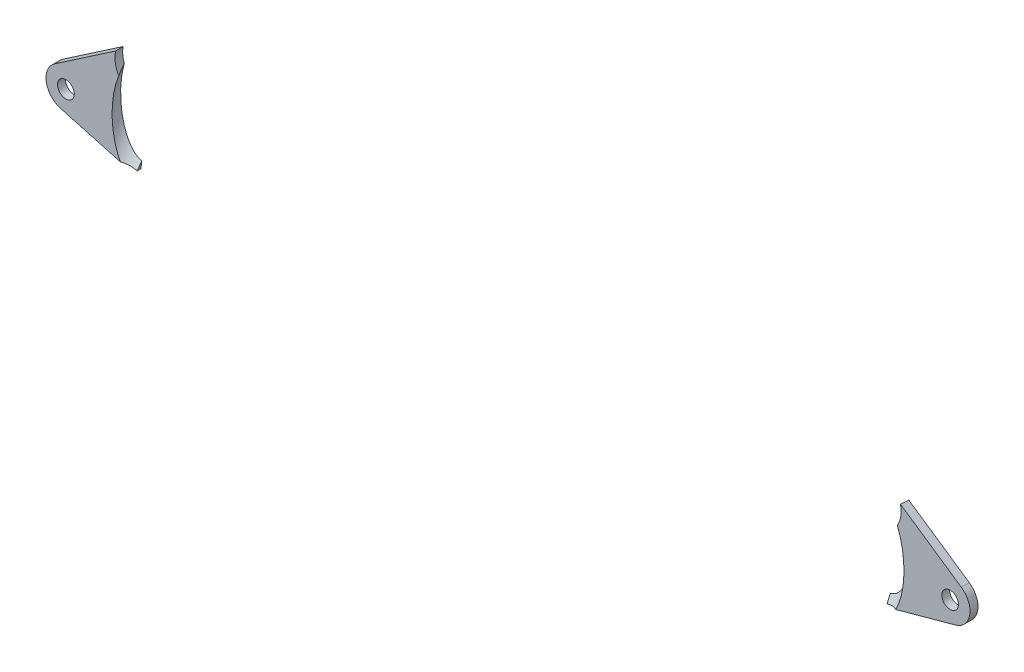
ISO-10303-21;
HEADER;
FILE_DESCRIPTION(('STEP AP214'),'2;1');
FILE_NAME('part.step','',(''),(''),'','','');
FILE_SCHEMA(('AUTOMOTIVE_DESIGN { 1 0 10303 214 1 1 1 1 }'));
ENDSEC;
DATA;
#1=APPLICATION_CONTEXT('core data for automotive mechanical design processes');
#2=APPLICATION_PROTOCOL_DEFINITION('international standard','automotive_design',2000,#1);
#3=PRODUCT_CONTEXT('',#1,'mechanical');
#4=PRODUCT('Part','Part','',(#3));
#5=PRODUCT_RELATED_PRODUCT_CATEGORY('part','',(#4));
#6=PRODUCT_DEFINITION_FORMATION('','',#4);
#7=PRODUCT_DEFINITION_CONTEXT('part definition',#1,'design');
#8=PRODUCT_DEFINITION('design','',#6,#7);
#9=PRODUCT_DEFINITION_SHAPE('','',#8);
#10=(LENGTH_UNIT() NAMED_UNIT(*) SI_UNIT(.MILLI.,.METRE.));
#11=(NAMED_UNIT(*) PLANE_ANGLE_UNIT() SI_UNIT($,.RADIAN.));
#12=(NAMED_UNIT(*) SI_UNIT($,.STERADIAN.) SOLID_ANGLE_UNIT());
#13=UNCERTAINTY_MEASURE_WITH_UNIT(LENGTH_MEASURE(1.E-05),#10,'distance_accuracy_value','');
#14=(GEOMETRIC_REPRESENTATION_CONTEXT(3) GLOBAL_UNCERTAINTY_ASSIGNED_CONTEXT((#13)) GLOBAL_UNIT_ASSIGNED_CONTEXT((#10,
#11,#12)) REPRESENTATION_CONTEXT('',''));
#15=CARTESIAN_POINT('',(0.,0.,0.));
#16=DIRECTION('',(0.,0.,1.));
#17=DIRECTION('',(1.,0.,0.));
#18=AXIS2_PLACEMENT_3D('',#15,#16,#17);
#19=CARTESIAN_POINT('',(-6.76283675777758E-06,4.26355604611976E-06,-523.500007590512));
#20=DIRECTION('',(-1.28205434326738E-08,8.08257059396244E-09,-1.));
#21=DIRECTION('',(1.,0.,-1.28205434326738E-08));
#22=AXIS2_PLACEMENT_3D('',#19,#20,#21);
#23=PLANE('',#22);
#24=CARTESIAN_POINT('',(-221.892352261675,576.107647738325,-523.5));
#25=DIRECTION('',(-1.78976740835188E-08,-2.85283172746497E-08,-0.999999999999999));
#26=DIRECTION('',(0.,-1.,2.85283172746497E-08));
#27=AXIS2_PLACEMENT_3D('',#24,#25,#26);
#28=CIRCLE('',#27,4.19999999999995);
#29=CARTESIAN_POINT('',(-221.892352261675,571.907647738325,-523.499999880181));
#30=VERTEX_POINT('',#29);
#31=EDGE_CURVE('E243',#30,#30,#28,.T.);
#32=ORIENTED_EDGE('',*,*,#31,.T.);
#33=EDGE_LOOP('',(#32));
#34=FACE_BOUND('',#33,.T.);
#35=CARTESIAN_POINT('',(-185.997260236363,578.761644787544,-523.500000528045));
#36=DIRECTION('',(1.28205434326738E-08,-8.08257059396244E-09,1.));
#37=DIRECTION('',(0.0394828741983421,0.999220247315394,7.57007628433665E-09));
#38=AXIS2_PLACEMENT_3D('',#35,#36,#37);
#39=ELLIPSE('',#38,26.1969464374496,12.7);
#40=CARTESIAN_POINT('',(-194.494659068228,558.21631498243,-523.500000348071));
#41=VERTEX_POINT('',#40);
#42=CARTESIAN_POINT('',(-195.357801000429,595.278762168306,-523.500000274537));
#43=VERTEX_POINT('',#42);
#44=EDGE_CURVE('E162',#41,#43,#39,.F.);
#45=ORIENTED_EDGE('',*,*,#44,.T.);
#46=CARTESIAN_POINT('',(-184.609302335556,602.072558188744,-523.500000357427));
#47=DIRECTION('',(1.28205434326738E-08,-8.08257059396244E-09,1.));
#48=DIRECTION('',(-0.198662351333892,0.98006799262219,1.04684280409652E-08));
#49=AXIS2_PLACEMENT_3D('',#46,#47,#48);
#50=ELLIPSE('',#49,12.8246926796099,12.7);
#51=CARTESIAN_POINT('',(-196.929839573321,605.249481408293,-523.500000000358));
#52=VERTEX_POINT('',#51);
#53=EDGE_CURVE('E211',#43,#52,#50,.F.);
#54=ORIENTED_EDGE('',*,*,#53,.T.);
#55=DIRECTION('',(-0.825991902443792,-0.563681982235804,2.80436123324251E-09));
#56=VECTOR('',#55,1.);
#57=CARTESIAN_POINT('',(-191.789711937302,608.75726075364,-523.500000017809));
#58=LINE('',#57,#56);
#59=CARTESIAN_POINT('',(-227.529172084033,584.367566762763,-523.499999896469));
#60=VERTEX_POINT('',#59);
#61=EDGE_CURVE('E249',#52,#60,#58,.T.);
#62=ORIENTED_EDGE('',*,*,#61,.T.);
#63=CARTESIAN_POINT('',(-221.892352261675,576.107647738325,-523.5));
#64=DIRECTION('',(8.15225942307762E-09,-6.97084612255593E-09,1.));
#65=DIRECTION('',(1.,0.,-8.15225942307762E-09));
#66=AXIS2_PLACEMENT_3D('',#63,#64,#65);
#67=CIRCLE('',#66,10.0000000000001);
#68=CARTESIAN_POINT('',(-224.539659918857,566.464424098471,-523.50000004564));
#69=VERTEX_POINT('',#68);
#70=EDGE_CURVE('E252',#60,#69,#67,.T.);
#71=ORIENTED_EDGE('',*,*,#70,.T.);
#72=DIRECTION('',(-0.964322363985336,0.26473076571818,9.7067964222213E-09));
#73=VECTOR('',#72,1.);
#74=CARTESIAN_POINT('',(-188.174312205241,556.481220653881,-523.500000411691));
#75=LINE('',#74,#73);
#76=EDGE_CURVE('E266',#41,#69,#75,.T.);
#77=ORIENTED_EDGE('',*,*,#76,.F.);
#78=EDGE_LOOP('',(#45,#54,#62,#71,#77));
#79=FACE_BOUND('',#78,.T.);
#80=ADVANCED_FACE('F153',(#34,#79),#23,.F.);
#81=CARTESIAN_POINT('',(-6.76283675804992E-06,4.26355604966604E-06,-527.500007590512));
#82=DIRECTION('',(-1.28205434326738E-08,8.08257059396244E-09,-1.));
#83=DIRECTION('',(1.,0.,-1.28205434326738E-08));
#84=AXIS2_PLACEMENT_3D('',#81,#82,#83);
#85=PLANE('',#84);
#86=CARTESIAN_POINT('',(-221.892352261675,576.107647738325,-527.5));
#87=DIRECTION('',(-1.78976740835188E-08,-2.85283172746497E-08,-0.999999999999999));
#88=DIRECTION('',(0.,-1.,2.85283172746497E-08));
#89=AXIS2_PLACEMENT_3D('',#86,#87,#88);
#90=CIRCLE('',#89,4.19999999999995);
#91=CARTESIAN_POINT('',(-221.892352261675,571.907647738325,-527.499999880181));
#92=VERTEX_POINT('',#91);
#93=EDGE_CURVE('E221',#92,#92,#90,.T.);
#94=ORIENTED_EDGE('',*,*,#93,.F.);
#95=EDGE_LOOP('',(#94));
#96=FACE_BOUND('',#95,.T.);
#97=DIRECTION('',(-0.0815294772708344,-0.99667093081716,1.03961991727305E-09));
#98=VECTOR('',#97,1.);
#99=CARTESIAN_POINT('',(-184.720930245276,598.697674477955,-527.500000455726));
#100=LINE('',#99,#98);
#101=CARTESIAN_POINT('',(-187.890655415792,559.948831214335,-527.500000415308));
#102=VERTEX_POINT('',#101);
#103=CARTESIAN_POINT('',(-188.174312205241,556.481220653881,-527.500000411691));
#104=VERTEX_POINT('',#103);
#105=EDGE_CURVE('E277',#102,#104,#100,.T.);
#106=ORIENTED_EDGE('',*,*,#105,.T.);
#107=DIRECTION('',(-0.964322363985336,0.26473076571818,9.7067964222213E-09));
#108=VECTOR('',#107,1.);
#109=CARTESIAN_POINT('',(-188.174312205241,556.481220653881,-527.500000411691));
#110=LINE('',#109,#108);
#111=CARTESIAN_POINT('',(-224.539659918857,566.464424098471,-527.50000004564));
#112=VERTEX_POINT('',#111);
#113=EDGE_CURVE('E244',#104,#112,#110,.T.);
#114=ORIENTED_EDGE('',*,*,#113,.T.);
#115=CARTESIAN_POINT('',(-221.892352261675,576.107647738325,-527.5));
#116=DIRECTION('',(8.15225942307762E-09,-6.97084612255593E-09,1.));
#117=DIRECTION('',(1.,0.,-8.15225942307762E-09));
#118=AXIS2_PLACEMENT_3D('',#115,#116,#117);
#119=CIRCLE('',#118,10.0000000000001);
#120=CARTESIAN_POINT('',(-227.529172084033,584.367566762763,-527.499999896469));
#121=VERTEX_POINT('',#120);
#122=EDGE_CURVE('E228',#121,#112,#119,.T.);
#123=ORIENTED_EDGE('',*,*,#122,.F.);
#124=DIRECTION('',(-0.825991902443792,-0.563681982235804,2.80436123324251E-09));
#125=VECTOR('',#124,1.);
#126=CARTESIAN_POINT('',(-191.789711937302,608.75726075364,-527.500000017809));
#127=LINE('',#126,#125);
#128=CARTESIAN_POINT('',(-197.202740767991,605.063245337563,-527.499999999431));
#129=VERTEX_POINT('',#128);
#130=EDGE_CURVE('E226',#129,#121,#127,.T.);
#131=ORIENTED_EDGE('',*,*,#130,.F.);
#132=CARTESIAN_POINT('',(-184.720930242369,602.623255862352,-527.500000351545));
#133=DIRECTION('',(1.28205434326738E-08,-8.08257059396244E-09,1.));
#134=DIRECTION('',(-0.198662351333892,0.98006799262219,1.04684280409652E-08));
#135=AXIS2_PLACEMENT_3D('',#132,#133,#134);
#136=ELLIPSE('',#135,12.8246926796099,12.7);
#137=CARTESIAN_POINT('',(-196.600940213147,598.124746547628,-527.500000235596));
#138=VERTEX_POINT('',#137);
#139=EDGE_CURVE('E208',#138,#129,#136,.F.);
#140=ORIENTED_EDGE('',*,*,#139,.F.);
#141=CARTESIAN_POINT('',(-185.712328733405,585.97260359317,-527.500000473415));
#142=DIRECTION('',(1.28205434326738E-08,-8.08257059396244E-09,1.));
#143=DIRECTION('',(0.0394828741983421,0.999220247315394,7.57007628433665E-09));
#144=AXIS2_PLACEMENT_3D('',#141,#142,#143);
#145=ELLIPSE('',#144,26.1969464374496,12.7);
#146=EDGE_CURVE('E214',#102,#138,#145,.F.);
#147=ORIENTED_EDGE('',*,*,#146,.F.);
#148=EDGE_LOOP('',(#106,#114,#123,#131,#140,#147));
#149=FACE_BOUND('',#148,.T.);
#150=ADVANCED_FACE('F223',(#96,#149),#85,.T.);
#151=CARTESIAN_POINT('',(-191.789711937302,608.75726075364,-527.500000017809));
#152=DIRECTION('',(0.563681982235804,-0.825991902443792,0.));
#153=DIRECTION('',(-0.825991902443792,-0.563681982235804,0.));
#154=AXIS2_PLACEMENT_3D('',#151,#152,#153);
#155=PLANE('',#154);
#156=CARTESIAN_POINT('',(-186.67221539572,612.249595952218,-597.421051679941));
#157=DIRECTION('',(-0.563681982235804,0.825991902443792,0.));
#158=DIRECTION('',(0.0449939715456335,0.0307052538825957,-0.9985152627319));
#159=AXIS2_PLACEMENT_3D('',#156,#157,#158);
#160=ELLIPSE('',#159,99.07168730493,12.7);
#161=EDGE_CURVE('E270',#52,#129,#160,.F.);
#162=ORIENTED_EDGE('',*,*,#161,.T.);
#163=ORIENTED_EDGE('',*,*,#130,.T.);
#164=DIRECTION('',(0.,0.,1.));
#165=VECTOR('',#164,1.);
#166=CARTESIAN_POINT('',(-227.529172084033,584.367566762763,-527.499999896469));
#167=LINE('',#166,#165);
#168=EDGE_CURVE('E238',#121,#60,#167,.T.);
#169=ORIENTED_EDGE('',*,*,#168,.T.);
#170=ORIENTED_EDGE('',*,*,#61,.F.);
#171=EDGE_LOOP('',(#162,#163,#169,#170));
#172=FACE_BOUND('',#171,.T.);
#173=ADVANCED_FACE('F287',(#172),#155,.F.);
#174=CARTESIAN_POINT('',(-221.892352261675,576.107647738325,-527.5));
#175=DIRECTION('',(0.,0.,1.));
#176=DIRECTION('',(0.,-1.,0.));
#177=AXIS2_PLACEMENT_3D('',#174,#175,#176);
#178=CYLINDRICAL_SURFACE('',#177,10.0000000000001);
#179=ORIENTED_EDGE('',*,*,#70,.F.);
#180=ORIENTED_EDGE('',*,*,#168,.F.);
#181=ORIENTED_EDGE('',*,*,#122,.T.);
#182=DIRECTION('',(0.,0.,1.));
#183=VECTOR('',#182,1.);
#184=CARTESIAN_POINT('',(-224.539659918857,566.464424098471,-527.50000004564));
#185=LINE('',#184,#183);
#186=EDGE_CURVE('E241',#112,#69,#185,.T.);
#187=ORIENTED_EDGE('',*,*,#186,.T.);
#188=EDGE_LOOP('',(#179,#180,#181,#187));
#189=FACE_BOUND('',#188,.T.);
#190=ADVANCED_FACE('F284',(#189),#178,.T.);
#191=CARTESIAN_POINT('',(-184.720930245276,598.697674477955,-527.500000455726));
#192=DIRECTION('',(0.99667093081716,-0.0815294772708344,0.));
#193=DIRECTION('',(-0.0815294772708344,-0.99667093081716,0.));
#194=AXIS2_PLACEMENT_3D('',#191,#192,#193);
#195=PLANE('',#194);
#196=DIRECTION('',(0.,0.,1.));
#197=VECTOR('',#196,1.);
#198=CARTESIAN_POINT('',(-188.174312205241,556.481220653881,-527.500000411691));
#199=LINE('',#198,#197);
#200=CARTESIAN_POINT('',(-188.174312205241,556.481220653881,-525.557068454305));
#201=VERTEX_POINT('',#200);
#202=EDGE_CURVE('E235',#104,#201,#199,.T.);
#203=ORIENTED_EDGE('',*,*,#202,.F.);
#204=ORIENTED_EDGE('',*,*,#105,.F.);
#205=CARTESIAN_POINT('',(-185.666043418442,587.143978102622,-528.149775087321));
#206=DIRECTION('',(-0.99667093081716,0.0815294772708344,0.));
#207=DIRECTION('',(0.0712933211814233,0.87153730358032,-0.485118532755519));
#208=AXIS2_PLACEMENT_3D('',#205,#206,#207);
#209=ELLIPSE('',#208,344.784270870178,12.7);
#210=EDGE_CURVE('E217',#201,#102,#209,.F.);
#211=ORIENTED_EDGE('',*,*,#210,.F.);
#212=EDGE_LOOP('',(#203,#204,#211));
#213=FACE_BOUND('',#212,.T.);
#214=ADVANCED_FACE('F294',(#213),#195,.T.);
#215=CARTESIAN_POINT('',(-188.174312205241,556.481220653881,-527.500000411691));
#216=DIRECTION('',(-0.26473076571818,-0.964322363985336,0.));
#217=DIRECTION('',(-0.964322363985336,0.26473076571818,0.));
#218=AXIS2_PLACEMENT_3D('',#215,#216,#217);
#219=PLANE('',#218);
#220=ORIENTED_EDGE('',*,*,#76,.T.);
#221=ORIENTED_EDGE('',*,*,#186,.F.);
#222=ORIENTED_EDGE('',*,*,#113,.F.);
#223=ORIENTED_EDGE('',*,*,#202,.T.);
#224=CARTESIAN_POINT('',(-186.891556429484,556.129071900075,-510.94545781691));
#225=DIRECTION('',(0.26473076571818,0.964322363985336,0.));
#226=DIRECTION('',(-0.36470983726188,0.100122031894263,-0.925722589836598));
#227=AXIS2_PLACEMENT_3D('',#224,#225,#226);
#228=ELLIPSE('',#227,14.9076699502055,12.7);
#229=EDGE_CURVE('E170',#41,#201,#228,.F.);
#230=ORIENTED_EDGE('',*,*,#229,.F.);
#231=EDGE_LOOP('',(#220,#221,#222,#223,#230));
#232=FACE_BOUND('',#231,.T.);
#233=ADVANCED_FACE('F282',(#232),#219,.T.);
#234=CARTESIAN_POINT('',(-221.892352261675,576.107647738325,-527.5));
#235=DIRECTION('',(0.,0.,1.));
#236=DIRECTION('',(0.,-1.,0.));
#237=AXIS2_PLACEMENT_3D('',#234,#235,#236);
#238=CYLINDRICAL_SURFACE('',#237,4.19999999999995);
#239=CARTESIAN_POINT('',(-221.892352261675,571.907647738325,-527.499999880181));
#240=CARTESIAN_POINT('',(-221.892352261675,571.907647738325,-527.458333213514));
#241=CARTESIAN_POINT('',(-221.892352261675,571.907647738325,-527.416666546848));
#242=CARTESIAN_POINT('',(-221.892352261675,571.907647738325,-527.333333213514));
#243=CARTESIAN_POINT('',(-221.892352261675,571.907647738325,-527.291666546848));
#244=CARTESIAN_POINT('',(-221.892352261675,571.907647738325,-527.208333213514));
#245=CARTESIAN_POINT('',(-221.892352261675,571.907647738325,-527.166666546848));
#246=CARTESIAN_POINT('',(-221.892352261675,571.907647738325,-527.083333213514));
#247=CARTESIAN_POINT('',(-221.892352261675,571.907647738325,-527.041666546848));
#248=CARTESIAN_POINT('',(-221.892352261675,571.907647738325,-526.958333213514));
#249=CARTESIAN_POINT('',(-221.892352261675,571.907647738325,-526.916666546848));
#250=CARTESIAN_POINT('',(-221.892352261675,571.907647738325,-526.833333213514));
#251=CARTESIAN_POINT('',(-221.892352261675,571.907647738325,-526.791666546848));
#252=CARTESIAN_POINT('',(-221.892352261675,571.907647738325,-526.708333213514));
#253=CARTESIAN_POINT('',(-221.892352261675,571.907647738325,-526.666666546848));
#254=CARTESIAN_POINT('',(-221.892352261675,571.907647738325,-526.583333213514));
#255=CARTESIAN_POINT('',(-221.892352261675,571.907647738325,-526.541666546848));
#256=CARTESIAN_POINT('',(-221.892352261675,571.907647738325,-526.458333213514));
#257=CARTESIAN_POINT('',(-221.892352261675,571.907647738325,-526.416666546848));
#258=CARTESIAN_POINT('',(-221.892352261675,571.907647738325,-526.333333213514));
#259=CARTESIAN_POINT('',(-221.892352261675,571.907647738325,-526.291666546848));
#260=CARTESIAN_POINT('',(-221.892352261675,571.907647738325,-526.208333213514));
#261=CARTESIAN_POINT('',(-221.892352261675,571.907647738325,-526.166666546848));
#262=CARTESIAN_POINT('',(-221.892352261675,571.907647738325,-526.083333213514));
#263=CARTESIAN_POINT('',(-221.892352261675,571.907647738325,-526.041666546848));
#264=CARTESIAN_POINT('',(-221.892352261675,571.907647738325,-525.958333213514));
#265=CARTESIAN_POINT('',(-221.892352261675,571.907647738325,-525.916666546848));
#266=CARTESIAN_POINT('',(-221.892352261675,571.907647738325,-525.833333213514));
#267=CARTESIAN_POINT('',(-221.892352261675,571.907647738325,-525.791666546848));
#268=CARTESIAN_POINT('',(-221.892352261675,571.907647738325,-525.708333213514));
#269=CARTESIAN_POINT('',(-221.892352261675,571.907647738325,-525.666666546848));
#270=CARTESIAN_POINT('',(-221.892352261675,571.907647738325,-525.583333213514));
#271=CARTESIAN_POINT('',(-221.892352261675,571.907647738325,-525.541666546848));
#272=CARTESIAN_POINT('',(-221.892352261675,571.907647738325,-525.458333213514));
#273=CARTESIAN_POINT('',(-221.892352261675,571.907647738325,-525.416666546848));
#274=CARTESIAN_POINT('',(-221.892352261675,571.907647738325,-525.333333213514));
#275=CARTESIAN_POINT('',(-221.892352261675,571.907647738325,-525.291666546848));
#276=CARTESIAN_POINT('',(-221.892352261675,571.907647738325,-525.208333213514));
#277=CARTESIAN_POINT('',(-221.892352261675,571.907647738325,-525.166666546848));
#278=CARTESIAN_POINT('',(-221.892352261675,571.907647738325,-525.083333213514));
#279=CARTESIAN_POINT('',(-221.892352261675,571.907647738325,-525.041666546848));
#280=CARTESIAN_POINT('',(-221.892352261675,571.907647738325,-524.958333213514));
#281=CARTESIAN_POINT('',(-221.892352261675,571.907647738325,-524.916666546848));
#282=CARTESIAN_POINT('',(-221.892352261675,571.907647738325,-524.833333213514));
#283=CARTESIAN_POINT('',(-221.892352261675,571.907647738325,-524.791666546848));
#284=CARTESIAN_POINT('',(-221.892352261675,571.907647738325,-524.708333213514));
#285=CARTESIAN_POINT('',(-221.892352261675,571.907647738325,-524.666666546848));
#286=CARTESIAN_POINT('',(-221.892352261675,571.907647738325,-524.583333213514));
#287=CARTESIAN_POINT('',(-221.892352261675,571.907647738325,-524.541666546848));
#288=CARTESIAN_POINT('',(-221.892352261675,571.907647738325,-524.458333213514));
#289=CARTESIAN_POINT('',(-221.892352261675,571.907647738325,-524.416666546848));
#290=CARTESIAN_POINT('',(-221.892352261675,571.907647738325,-524.333333213514));
#291=CARTESIAN_POINT('',(-221.892352261675,571.907647738325,-524.291666546848));
#292=CARTESIAN_POINT('',(-221.892352261675,571.907647738325,-524.208333213514));
#293=CARTESIAN_POINT('',(-221.892352261675,571.907647738325,-524.166666546848));
#294=CARTESIAN_POINT('',(-221.892352261675,571.907647738325,-524.083333213514));
#295=CARTESIAN_POINT('',(-221.892352261675,571.907647738325,-524.041666546848));
#296=CARTESIAN_POINT('',(-221.892352261675,571.907647738325,-523.958333213514));
#297=CARTESIAN_POINT('',(-221.892352261675,571.907647738325,-523.916666546848));
#298=CARTESIAN_POINT('',(-221.892352261675,571.907647738325,-523.833333213514));
#299=CARTESIAN_POINT('',(-221.892352261675,571.907647738325,-523.791666546848));
#300=CARTESIAN_POINT('',(-221.892352261675,571.907647738325,-523.708333213514));
#301=CARTESIAN_POINT('',(-221.892352261675,571.907647738325,-523.666666546848));
#302=CARTESIAN_POINT('',(-221.892352261675,571.907647738325,-523.583333213514));
#303=CARTESIAN_POINT('',(-221.892352261675,571.907647738325,-523.541666546848));
#304=CARTESIAN_POINT('',(-221.892352261675,571.907647738325,-523.499999880181));
#305=B_SPLINE_CURVE_WITH_KNOTS('',3,(#239,#240,#241,#242,#243,#244,#245,#246,#247,#248,#249,
#250,#251,#252,#253,#254,#255,#256,#257,#258,#259,#260,#261,#262,#263,#264,#265,#266,#267,#268,
#269,#270,#271,#272,#273,#274,#275,#276,#277,#278,#279,#280,#281,#282,#283,#284,#285,#286,#287,
#288,#289,#290,#291,#292,#293,#294,#295,#296,#297,#298,#299,#300,#301,#302,#303,#304),
.UNSPECIFIED.,.F.,.F.,(4,2,2,2,2,2,2,2,2,2,2,2,2,2,2,2,2,2,2,2,2,2,2,2,2,2,2,2,2,2,2,2,4),(0.,
0.125000000000042,0.250000000000083,0.375000000000014,0.500000000000056,0.625000000000098,
0.750000000000028,0.87500000000007,1.00000000000011,1.12500000000004,1.25000000000008,
1.37500000000002,1.50000000000006,1.6250000000001,1.75000000000003,1.87500000000007,2.,
2.12500000000004,2.25000000000009,2.37500000000002,2.50000000000006,2.6250000000001,
2.75000000000003,2.87500000000007,3.00000000000011,3.12500000000004,3.25000000000009,
3.37500000000002,3.50000000000006,3.6250000000001,3.75000000000003,3.87500000000007,4.),.UNSPECIFIED.);
#306=EDGE_CURVE('BSEAM304',#92,#30,#305,.T.);
#307=ORIENTED_EDGE('',*,*,#93,.T.);
#308=ORIENTED_EDGE('',*,*,#31,.F.);
#309=ORIENTED_EDGE('',*,*,#306,.T.);
#310=ORIENTED_EDGE('',*,*,#306,.F.);
#311=EDGE_LOOP('',(#307,#309,#308,#310));
#312=FACE_BOUND('',#311,.T.);
#313=ADVANCED_FACE('F304',(#312),#238,.F.);
#314=CARTESIAN_POINT('',(-170.,530.,-1.17757295387957E-10));
#315=DIRECTION('',(-0.0276356411014467,0.136335829433805,-0.990277139468295));
#316=DIRECTION('',(0.,-0.990655507726031,-0.136387921063707));
#317=AXIS2_PLACEMENT_3D('',#314,#315,#316);
#318=CYLINDRICAL_SURFACE('',#317,12.7);
#319=CARTESIAN_POINT('',(-185.000000000005,604.000000000001,-537.5));
#320=DIRECTION('',(-0.0693569344755852,-0.822901001912123,-0.563935773552426));
#321=DIRECTION('',(0.00385778984267563,0.56507159045478,-0.825032856993245));
#322=AXIS2_PLACEMENT_3D('',#319,#320,#321);
#323=ELLIPSE('',#322,28.3369214286638,12.7);
#324=EDGE_CURVE('E13',#43,#138,#323,.T.);
#325=ORIENTED_EDGE('',*,*,#324,.T.);
#326=ORIENTED_EDGE('',*,*,#139,.T.);
#327=ORIENTED_EDGE('',*,*,#161,.F.);
#328=ORIENTED_EDGE('',*,*,#53,.F.);
#329=EDGE_LOOP('',(#325,#326,#327,#328));
#330=FACE_BOUND('',#329,.T.);
#331=ADVANCED_FACE('F206',(#330),#318,.F.);
#332=CARTESIAN_POINT('',(-197.999999999995,275.,-355.));
#333=DIRECTION('',(0.0345329378006142,0.873948964339317,-0.484789319124394));
#334=DIRECTION('',(0.,-0.485078639314891,-0.874470533340269));
#335=AXIS2_PLACEMENT_3D('',#332,#333,#334);
#336=CYLINDRICAL_SURFACE('',#335,12.7);
#337=ORIENTED_EDGE('',*,*,#44,.F.);
#338=ORIENTED_EDGE('',*,*,#229,.T.);
#339=ORIENTED_EDGE('',*,*,#210,.T.);
#340=ORIENTED_EDGE('',*,*,#146,.T.);
#341=ORIENTED_EDGE('',*,*,#324,.F.);
#342=EDGE_LOOP('',(#337,#338,#339,#340,#341));
#343=FACE_BOUND('',#342,.T.);
#344=ADVANCED_FACE('F215',(#343),#336,.F.);
#345=CLOSED_SHELL('',(#80,#150,#173,#190,#214,#233,#313,#331,#344));
#346=MANIFOLD_SOLID_BREP('B2',#345);
#347=CARTESIAN_POINT('',(6.76283675777758E-06,4.26355604611976E-06,-523.500007590512));
#348=DIRECTION('',(1.28205434326738E-08,8.08257059396244E-09,-1.));
#349=DIRECTION('',(-1.,0.,-1.28205434326738E-08));
#350=AXIS2_PLACEMENT_3D('',#347,#348,#349);
#351=PLANE('',#350);
#352=CARTESIAN_POINT('',(221.892352261675,576.107647738325,-523.5));
#353=DIRECTION('',(-1.78976740835188E-08,2.85283172746497E-08,0.999999999999999));
#354=DIRECTION('',(0.,-1.,2.85283172746497E-08));
#355=AXIS2_PLACEMENT_3D('',#352,#353,#354);
#356=CIRCLE('',#355,4.19999999999995);
#357=CARTESIAN_POINT('',(221.892352261675,571.907647738325,-523.499999880181));
#358=VERTEX_POINT('',#357);
#359=EDGE_CURVE('E462',#358,#358,#356,.T.);
#360=ORIENTED_EDGE('',*,*,#359,.F.);
#361=EDGE_LOOP('',(#360));
#362=FACE_BOUND('',#361,.T.);
#363=CARTESIAN_POINT('',(185.997260236363,578.761644787544,-523.500000528045));
#364=DIRECTION('',(1.28205434326738E-08,8.08257059396244E-09,-1.));
#365=DIRECTION('',(-0.0394828741983421,0.999220247315394,7.57007628433665E-09));
#366=AXIS2_PLACEMENT_3D('',#363,#364,#365);
#367=ELLIPSE('',#366,26.1969464374496,12.7);
#368=CARTESIAN_POINT('',(194.494659068228,558.21631498243,-523.500000348071));
#369=VERTEX_POINT('',#368);
#370=CARTESIAN_POINT('',(195.357801000429,595.278762168306,-523.500000274537));
#371=VERTEX_POINT('',#370);
#372=EDGE_CURVE('E383',#369,#371,#367,.F.);
#373=ORIENTED_EDGE('',*,*,#372,.F.);
#374=DIRECTION('',(0.964322363985336,0.26473076571818,9.7067964222213E-09));
#375=VECTOR('',#374,1.);
#376=CARTESIAN_POINT('',(188.174312205241,556.481220653881,-523.500000411691));
#377=LINE('',#376,#375);
#378=CARTESIAN_POINT('',(224.539659918857,566.464424098471,-523.50000004564));
#379=VERTEX_POINT('',#378);
#380=EDGE_CURVE('E485',#369,#379,#377,.T.);
#381=ORIENTED_EDGE('',*,*,#380,.T.);
#382=CARTESIAN_POINT('',(221.892352261675,576.107647738325,-523.5));
#383=DIRECTION('',(8.15225942307762E-09,6.97084612255593E-09,-1.));
#384=DIRECTION('',(-1.,0.,-8.15225942307762E-09));
#385=AXIS2_PLACEMENT_3D('',#382,#383,#384);
#386=CIRCLE('',#385,10.0000000000001);
#387=CARTESIAN_POINT('',(227.529172084033,584.367566762763,-523.499999896469));
#388=VERTEX_POINT('',#387);
#389=EDGE_CURVE('E471',#388,#379,#386,.T.);
#390=ORIENTED_EDGE('',*,*,#389,.F.);
#391=DIRECTION('',(0.825991902443792,-0.563681982235804,2.80436123324251E-09));
#392=VECTOR('',#391,1.);
#393=CARTESIAN_POINT('',(191.789711937302,608.75726075364,-523.500000017809));
#394=LINE('',#393,#392);
#395=CARTESIAN_POINT('',(196.929839573321,605.249481408293,-523.500000000358));
#396=VERTEX_POINT('',#395);
#397=EDGE_CURVE('E468',#396,#388,#394,.T.);
#398=ORIENTED_EDGE('',*,*,#397,.F.);
#399=CARTESIAN_POINT('',(184.609302335556,602.072558188744,-523.500000357427));
#400=DIRECTION('',(1.28205434326738E-08,8.08257059396244E-09,-1.));
#401=DIRECTION('',(0.198662351333892,0.98006799262219,1.04684280409652E-08));
#402=AXIS2_PLACEMENT_3D('',#399,#400,#401);
#403=ELLIPSE('',#402,12.8246926796099,12.7);
#404=EDGE_CURVE('E447',#371,#396,#403,.F.);
#405=ORIENTED_EDGE('',*,*,#404,.F.);
#406=EDGE_LOOP('',(#373,#381,#390,#398,#405));
#407=FACE_BOUND('',#406,.T.);
#408=ADVANCED_FACE('F374',(#362,#407),#351,.F.);
#409=CARTESIAN_POINT('',(6.76283675804992E-06,4.26355604966604E-06,-527.500007590512));
#410=DIRECTION('',(1.28205434326738E-08,8.08257059396244E-09,-1.));
#411=DIRECTION('',(-1.,0.,-1.28205434326738E-08));
#412=AXIS2_PLACEMENT_3D('',#409,#410,#411);
#413=PLANE('',#412);
#414=CARTESIAN_POINT('',(221.892352261675,576.107647738325,-527.5));
#415=DIRECTION('',(-1.78976740835188E-08,2.85283172746497E-08,0.999999999999999));
#416=DIRECTION('',(0.,-1.,2.85283172746497E-08));
#417=AXIS2_PLACEMENT_3D('',#414,#415,#416);
#418=CIRCLE('',#417,4.19999999999995);
#419=CARTESIAN_POINT('',(221.892352261675,571.907647738325,-527.499999880181));
#420=VERTEX_POINT('',#419);
#421=EDGE_CURVE('E435',#420,#420,#418,.T.);
#422=ORIENTED_EDGE('',*,*,#421,.T.);
#423=EDGE_LOOP('',(#422));
#424=FACE_BOUND('',#423,.T.);
#425=DIRECTION('',(0.0815294772708344,-0.99667093081716,1.03961991727305E-09));
#426=VECTOR('',#425,1.);
#427=CARTESIAN_POINT('',(184.720930245276,598.697674477955,-527.500000455726));
#428=LINE('',#427,#426);
#429=CARTESIAN_POINT('',(187.890655415792,559.948831214335,-527.500000415308));
#430=VERTEX_POINT('',#429);
#431=CARTESIAN_POINT('',(188.174312205241,556.481220653881,-527.500000411691));
#432=VERTEX_POINT('',#431);
#433=EDGE_CURVE('E434',#430,#432,#428,.T.);
#434=ORIENTED_EDGE('',*,*,#433,.F.);
#435=CARTESIAN_POINT('',(185.712328733405,585.97260359317,-527.500000473415));
#436=DIRECTION('',(1.28205434326738E-08,8.08257059396244E-09,-1.));
#437=DIRECTION('',(-0.0394828741983421,0.999220247315394,7.57007628433665E-09));
#438=AXIS2_PLACEMENT_3D('',#435,#436,#437);
#439=ELLIPSE('',#438,26.1969464374496,12.7);
#440=CARTESIAN_POINT('',(196.600940213147,598.124746547628,-527.500000235596));
#441=VERTEX_POINT('',#440);
#442=EDGE_CURVE('E423',#430,#441,#439,.F.);
#443=ORIENTED_EDGE('',*,*,#442,.T.);
#444=CARTESIAN_POINT('',(184.720930242369,602.623255862352,-527.500000351545));
#445=DIRECTION('',(1.28205434326738E-08,8.08257059396244E-09,-1.));
#446=DIRECTION('',(0.198662351333892,0.98006799262219,1.04684280409652E-08));
#447=AXIS2_PLACEMENT_3D('',#444,#445,#446);
#448=ELLIPSE('',#447,12.8246926796099,12.7);
#449=CARTESIAN_POINT('',(197.202740767991,605.063245337563,-527.499999999431));
#450=VERTEX_POINT('',#449);
#451=EDGE_CURVE('E431',#441,#450,#448,.F.);
#452=ORIENTED_EDGE('',*,*,#451,.T.);
#453=DIRECTION('',(0.825991902443792,-0.563681982235804,2.80436123324251E-09));
#454=VECTOR('',#453,1.);
#455=CARTESIAN_POINT('',(191.789711937302,608.75726075364,-527.500000017809));
#456=LINE('',#455,#454);
#457=CARTESIAN_POINT('',(227.529172084033,584.367566762763,-527.499999896469));
#458=VERTEX_POINT('',#457);
#459=EDGE_CURVE('E441',#450,#458,#456,.T.);
#460=ORIENTED_EDGE('',*,*,#459,.T.);
#461=CARTESIAN_POINT('',(221.892352261675,576.107647738325,-527.5));
#462=DIRECTION('',(8.15225942307762E-09,6.97084612255593E-09,-1.));
#463=DIRECTION('',(-1.,0.,-8.15225942307762E-09));
#464=AXIS2_PLACEMENT_3D('',#461,#462,#463);
#465=CIRCLE('',#464,10.0000000000001);
#466=CARTESIAN_POINT('',(224.539659918857,566.464424098471,-527.50000004564));
#467=VERTEX_POINT('',#466);
#468=EDGE_CURVE('E443',#458,#467,#465,.T.);
#469=ORIENTED_EDGE('',*,*,#468,.T.);
#470=DIRECTION('',(0.964322363985336,0.26473076571818,9.7067964222213E-09));
#471=VECTOR('',#470,1.);
#472=CARTESIAN_POINT('',(188.174312205241,556.481220653881,-527.500000411691));
#473=LINE('',#472,#471);
#474=EDGE_CURVE('E463',#432,#467,#473,.T.);
#475=ORIENTED_EDGE('',*,*,#474,.F.);
#476=EDGE_LOOP('',(#434,#443,#452,#460,#469,#475));
#477=FACE_BOUND('',#476,.T.);
#478=ADVANCED_FACE('F430',(#424,#477),#413,.T.);
#479=CARTESIAN_POINT('',(191.789711937302,608.75726075364,-527.500000017809));
#480=DIRECTION('',(-0.563681982235804,-0.825991902443792,0.));
#481=DIRECTION('',(0.825991902443792,-0.563681982235804,0.));
#482=AXIS2_PLACEMENT_3D('',#479,#480,#481);
#483=PLANE('',#482);
#484=CARTESIAN_POINT('',(186.67221539572,612.249595952218,-597.421051679941));
#485=DIRECTION('',(-0.563681982235804,-0.825991902443792,0.));
#486=DIRECTION('',(-0.0449939715456335,0.0307052538825957,-0.9985152627319));
#487=AXIS2_PLACEMENT_3D('',#484,#485,#486);
#488=ELLIPSE('',#487,99.07168730493,12.7);
#489=EDGE_CURVE('E439',#396,#450,#488,.F.);
#490=ORIENTED_EDGE('',*,*,#489,.F.);
#491=ORIENTED_EDGE('',*,*,#397,.T.);
#492=DIRECTION('',(0.,0.,1.));
#493=VECTOR('',#492,1.);
#494=CARTESIAN_POINT('',(227.529172084033,584.367566762763,-527.499999896469));
#495=LINE('',#494,#493);
#496=EDGE_CURVE('E456',#458,#388,#495,.T.);
#497=ORIENTED_EDGE('',*,*,#496,.F.);
#498=ORIENTED_EDGE('',*,*,#459,.F.);
#499=EDGE_LOOP('',(#490,#491,#497,#498));
#500=FACE_BOUND('',#499,.T.);
#501=ADVANCED_FACE('F511',(#500),#483,.F.);
#502=CARTESIAN_POINT('',(221.892352261675,576.107647738325,-527.5));
#503=DIRECTION('',(0.,0.,1.));
#504=DIRECTION('',(0.,-1.,0.));
#505=AXIS2_PLACEMENT_3D('',#502,#503,#504);
#506=CYLINDRICAL_SURFACE('',#505,10.0000000000001);
#507=ORIENTED_EDGE('',*,*,#389,.T.);
#508=DIRECTION('',(0.,0.,1.));
#509=VECTOR('',#508,1.);
#510=CARTESIAN_POINT('',(224.539659918857,566.464424098471,-527.50000004564));
#511=LINE('',#510,#509);
#512=EDGE_CURVE('E459',#467,#379,#511,.T.);
#513=ORIENTED_EDGE('',*,*,#512,.F.);
#514=ORIENTED_EDGE('',*,*,#468,.F.);
#515=ORIENTED_EDGE('',*,*,#496,.T.);
#516=EDGE_LOOP('',(#507,#513,#514,#515));
#517=FACE_BOUND('',#516,.T.);
#518=ADVANCED_FACE('F512',(#517),#506,.T.);
#519=CARTESIAN_POINT('',(184.720930245276,598.697674477955,-527.500000455726));
#520=DIRECTION('',(-0.99667093081716,-0.0815294772708344,0.));
#521=DIRECTION('',(0.0815294772708344,-0.99667093081716,0.));
#522=AXIS2_PLACEMENT_3D('',#519,#520,#521);
#523=PLANE('',#522);
#524=DIRECTION('',(0.,0.,1.));
#525=VECTOR('',#524,1.);
#526=CARTESIAN_POINT('',(188.174312205241,556.481220653881,-527.500000411691));
#527=LINE('',#526,#525);
#528=CARTESIAN_POINT('',(188.174312205241,556.481220653881,-525.557068454305));
#529=VERTEX_POINT('',#528);
#530=EDGE_CURVE('E451',#432,#529,#527,.T.);
#531=ORIENTED_EDGE('',*,*,#530,.T.);
#532=CARTESIAN_POINT('',(185.666043418442,587.143978102622,-528.149775087321));
#533=DIRECTION('',(-0.99667093081716,-0.0815294772708344,0.));
#534=DIRECTION('',(-0.0712933211814233,0.87153730358032,-0.485118532755519));
#535=AXIS2_PLACEMENT_3D('',#532,#533,#534);
#536=ELLIPSE('',#535,344.784270870178,12.7);
#537=EDGE_CURVE('E455',#529,#430,#536,.F.);
#538=ORIENTED_EDGE('',*,*,#537,.T.);
#539=ORIENTED_EDGE('',*,*,#433,.T.);
#540=EDGE_LOOP('',(#531,#538,#539));
#541=FACE_BOUND('',#540,.T.);
#542=ADVANCED_FACE('F500',(#541),#523,.T.);
#543=CARTESIAN_POINT('',(188.174312205241,556.481220653881,-527.500000411691));
#544=DIRECTION('',(0.26473076571818,-0.964322363985336,0.));
#545=DIRECTION('',(0.964322363985336,0.26473076571818,0.));
#546=AXIS2_PLACEMENT_3D('',#543,#544,#545);
#547=PLANE('',#546);
#548=ORIENTED_EDGE('',*,*,#380,.F.);
#549=CARTESIAN_POINT('',(186.891556429484,556.129071900075,-510.94545781691));
#550=DIRECTION('',(0.26473076571818,-0.964322363985336,0.));
#551=DIRECTION('',(0.36470983726188,0.100122031894263,-0.925722589836598));
#552=AXIS2_PLACEMENT_3D('',#549,#550,#551);
#553=ELLIPSE('',#552,14.9076699502055,12.7);
#554=EDGE_CURVE('E391',#369,#529,#553,.F.);
#555=ORIENTED_EDGE('',*,*,#554,.T.);
#556=ORIENTED_EDGE('',*,*,#530,.F.);
#557=ORIENTED_EDGE('',*,*,#474,.T.);
#558=ORIENTED_EDGE('',*,*,#512,.T.);
#559=EDGE_LOOP('',(#548,#555,#556,#557,#558));
#560=FACE_BOUND('',#559,.T.);
#561=ADVANCED_FACE('F501',(#560),#547,.T.);
#562=CARTESIAN_POINT('',(221.892352261675,576.107647738325,-527.5));
#563=DIRECTION('',(0.,0.,1.));
#564=DIRECTION('',(0.,-1.,0.));
#565=AXIS2_PLACEMENT_3D('',#562,#563,#564);
#566=CYLINDRICAL_SURFACE('',#565,4.19999999999995);
#567=CARTESIAN_POINT('',(221.892352261675,571.907647738325,-527.499999880181));
#568=CARTESIAN_POINT('',(221.892352261675,571.907647738325,-527.458333213514));
#569=CARTESIAN_POINT('',(221.892352261675,571.907647738325,-527.416666546848));
#570=CARTESIAN_POINT('',(221.892352261675,571.907647738325,-527.333333213514));
#571=CARTESIAN_POINT('',(221.892352261675,571.907647738325,-527.291666546848));
#572=CARTESIAN_POINT('',(221.892352261675,571.907647738325,-527.208333213514));
#573=CARTESIAN_POINT('',(221.892352261675,571.907647738325,-527.166666546848));
#574=CARTESIAN_POINT('',(221.892352261675,571.907647738325,-527.083333213514));
#575=CARTESIAN_POINT('',(221.892352261675,571.907647738325,-527.041666546848));
#576=CARTESIAN_POINT('',(221.892352261675,571.907647738325,-526.958333213514));
#577=CARTESIAN_POINT('',(221.892352261675,571.907647738325,-526.916666546848));
#578=CARTESIAN_POINT('',(221.892352261675,571.907647738325,-526.833333213514));
#579=CARTESIAN_POINT('',(221.892352261675,571.907647738325,-526.791666546848));
#580=CARTESIAN_POINT('',(221.892352261675,571.907647738325,-526.708333213514));
#581=CARTESIAN_POINT('',(221.892352261675,571.907647738325,-526.666666546848));
#582=CARTESIAN_POINT('',(221.892352261675,571.907647738325,-526.583333213514));
#583=CARTESIAN_POINT('',(221.892352261675,571.907647738325,-526.541666546848));
#584=CARTESIAN_POINT('',(221.892352261675,571.907647738325,-526.458333213514));
#585=CARTESIAN_POINT('',(221.892352261675,571.907647738325,-526.416666546848));
#586=CARTESIAN_POINT('',(221.892352261675,571.907647738325,-526.333333213514));
#587=CARTESIAN_POINT('',(221.892352261675,571.907647738325,-526.291666546848));
#588=CARTESIAN_POINT('',(221.892352261675,571.907647738325,-526.208333213514));
#589=CARTESIAN_POINT('',(221.892352261675,571.907647738325,-526.166666546848));
#590=CARTESIAN_POINT('',(221.892352261675,571.907647738325,-526.083333213514));
#591=CARTESIAN_POINT('',(221.892352261675,571.907647738325,-526.041666546848));
#592=CARTESIAN_POINT('',(221.892352261675,571.907647738325,-525.958333213514));
#593=CARTESIAN_POINT('',(221.892352261675,571.907647738325,-525.916666546848));
#594=CARTESIAN_POINT('',(221.892352261675,571.907647738325,-525.833333213514));
#595=CARTESIAN_POINT('',(221.892352261675,571.907647738325,-525.791666546848));
#596=CARTESIAN_POINT('',(221.892352261675,571.907647738325,-525.708333213514));
#597=CARTESIAN_POINT('',(221.892352261675,571.907647738325,-525.666666546848));
#598=CARTESIAN_POINT('',(221.892352261675,571.907647738325,-525.583333213514));
#599=CARTESIAN_POINT('',(221.892352261675,571.907647738325,-525.541666546848));
#600=CARTESIAN_POINT('',(221.892352261675,571.907647738325,-525.458333213514));
#601=CARTESIAN_POINT('',(221.892352261675,571.907647738325,-525.416666546848));
#602=CARTESIAN_POINT('',(221.892352261675,571.907647738325,-525.333333213514));
#603=CARTESIAN_POINT('',(221.892352261675,571.907647738325,-525.291666546848));
#604=CARTESIAN_POINT('',(221.892352261675,571.907647738325,-525.208333213514));
#605=CARTESIAN_POINT('',(221.892352261675,571.907647738325,-525.166666546848));
#606=CARTESIAN_POINT('',(221.892352261675,571.907647738325,-525.083333213514));
#607=CARTESIAN_POINT('',(221.892352261675,571.907647738325,-525.041666546848));
#608=CARTESIAN_POINT('',(221.892352261675,571.907647738325,-524.958333213514));
#609=CARTESIAN_POINT('',(221.892352261675,571.907647738325,-524.916666546848));
#610=CARTESIAN_POINT('',(221.892352261675,571.907647738325,-524.833333213514));
#611=CARTESIAN_POINT('',(221.892352261675,571.907647738325,-524.791666546848));
#612=CARTESIAN_POINT('',(221.892352261675,571.907647738325,-524.708333213514));
#613=CARTESIAN_POINT('',(221.892352261675,571.907647738325,-524.666666546848));
#614=CARTESIAN_POINT('',(221.892352261675,571.907647738325,-524.583333213514));
#615=CARTESIAN_POINT('',(221.892352261675,571.907647738325,-524.541666546848));
#616=CARTESIAN_POINT('',(221.892352261675,571.907647738325,-524.458333213514));
#617=CARTESIAN_POINT('',(221.892352261675,571.907647738325,-524.416666546848));
#618=CARTESIAN_POINT('',(221.892352261675,571.907647738325,-524.333333213514));
#619=CARTESIAN_POINT('',(221.892352261675,571.907647738325,-524.291666546848));
#620=CARTESIAN_POINT('',(221.892352261675,571.907647738325,-524.208333213514));
#621=CARTESIAN_POINT('',(221.892352261675,571.907647738325,-524.166666546848));
#622=CARTESIAN_POINT('',(221.892352261675,571.907647738325,-524.083333213514));
#623=CARTESIAN_POINT('',(221.892352261675,571.907647738325,-524.041666546848));
#624=CARTESIAN_POINT('',(221.892352261675,571.907647738325,-523.958333213514));
#625=CARTESIAN_POINT('',(221.892352261675,571.907647738325,-523.916666546848));
#626=CARTESIAN_POINT('',(221.892352261675,571.907647738325,-523.833333213514));
#627=CARTESIAN_POINT('',(221.892352261675,571.907647738325,-523.791666546848));
#628=CARTESIAN_POINT('',(221.892352261675,571.907647738325,-523.708333213514));
#629=CARTESIAN_POINT('',(221.892352261675,571.907647738325,-523.666666546848));
#630=CARTESIAN_POINT('',(221.892352261675,571.907647738325,-523.583333213514));
#631=CARTESIAN_POINT('',(221.892352261675,571.907647738325,-523.541666546848));
#632=CARTESIAN_POINT('',(221.892352261675,571.907647738325,-523.499999880181));
#633=B_SPLINE_CURVE_WITH_KNOTS('',3,(#567,#568,#569,#570,#571,#572,#573,#574,#575,#576,#577,
#578,#579,#580,#581,#582,#583,#584,#585,#586,#587,#588,#589,#590,#591,#592,#593,#594,#595,#596,
#597,#598,#599,#600,#601,#602,#603,#604,#605,#606,#607,#608,#609,#610,#611,#612,#613,#614,#615,
#616,#617,#618,#619,#620,#621,#622,#623,#624,#625,#626,#627,#628,#629,#630,#631,#632),
.UNSPECIFIED.,.F.,.F.,(4,2,2,2,2,2,2,2,2,2,2,2,2,2,2,2,2,2,2,2,2,2,2,2,2,2,2,2,2,2,2,2,4),(0.,
0.124999999999931,0.249999999999972,0.374999999999903,0.499999999999945,0.624999999999987,
0.749999999999917,0.874999999999959,0.99999999999989,1.12499999999993,1.24999999999997,
1.3749999999999,1.49999999999995,1.62499999999999,1.74999999999992,1.87499999999996,2.,
2.12499999999993,2.24999999999997,2.3749999999999,2.49999999999995,2.62499999999999,
2.74999999999992,2.87499999999996,2.99999999999989,3.12499999999993,3.24999999999998,
3.37499999999991,3.49999999999995,3.62499999999999,3.74999999999992,3.87499999999996,4.),.UNSPECIFIED.);
#634=EDGE_CURVE('BSEAM503',#420,#358,#633,.T.);
#635=ORIENTED_EDGE('',*,*,#421,.F.);
#636=ORIENTED_EDGE('',*,*,#359,.T.);
#637=ORIENTED_EDGE('',*,*,#634,.T.);
#638=ORIENTED_EDGE('',*,*,#634,.F.);
#639=EDGE_LOOP('',(#635,#637,#636,#638));
#640=FACE_BOUND('',#639,.T.);
#641=ADVANCED_FACE('F503',(#640),#566,.F.);
#642=CARTESIAN_POINT('',(170.,530.,-1.17757295387957E-10));
#643=DIRECTION('',(0.0276356411014467,0.136335829433805,-0.990277139468295));
#644=DIRECTION('',(0.,-0.990655507726031,-0.136387921063707));
#645=AXIS2_PLACEMENT_3D('',#642,#643,#644);
#646=CYLINDRICAL_SURFACE('',#645,12.7);
#647=CARTESIAN_POINT('',(185.000000000005,604.000000000001,-537.5));
#648=DIRECTION('',(-0.0693569344755852,0.822901001912123,0.563935773552426));
#649=DIRECTION('',(-0.00385778984267563,0.56507159045478,-0.825032856993245));
#650=AXIS2_PLACEMENT_3D('',#647,#648,#649);
#651=ELLIPSE('',#650,28.3369214286638,12.7);
#652=EDGE_CURVE('E151',#371,#441,#651,.T.);
#653=ORIENTED_EDGE('',*,*,#652,.F.);
#654=ORIENTED_EDGE('',*,*,#404,.T.);
#655=ORIENTED_EDGE('',*,*,#489,.T.);
#656=ORIENTED_EDGE('',*,*,#451,.F.);
#657=EDGE_LOOP('',(#653,#654,#655,#656));
#658=FACE_BOUND('',#657,.T.);
#659=ADVANCED_FACE('F437',(#658),#646,.F.);
#660=CARTESIAN_POINT('',(197.999999999995,275.,-355.));
#661=DIRECTION('',(-0.0345329378006142,0.873948964339317,-0.484789319124394));
#662=DIRECTION('',(0.,-0.485078639314891,-0.874470533340269));
#663=AXIS2_PLACEMENT_3D('',#660,#661,#662);
#664=CYLINDRICAL_SURFACE('',#663,12.7);
#665=ORIENTED_EDGE('',*,*,#372,.T.);
#666=ORIENTED_EDGE('',*,*,#652,.T.);
#667=ORIENTED_EDGE('',*,*,#442,.F.);
#668=ORIENTED_EDGE('',*,*,#537,.F.);
#669=ORIENTED_EDGE('',*,*,#554,.F.);
#670=EDGE_LOOP('',(#665,#666,#667,#668,#669));
#671=FACE_BOUND('',#670,.T.);
#672=ADVANCED_FACE('F422',(#671),#664,.F.);
#673=CLOSED_SHELL('',(#408,#478,#501,#518,#542,#561,#641,#659,#672));
#674=MANIFOLD_SOLID_BREP('B7',#673);
#675=ADVANCED_BREP_SHAPE_REPRESENTATION('',(#18,#346,#674),#14);
#676=SHAPE_DEFINITION_REPRESENTATION(#9,#675);
ENDSEC;
END-ISO-10303-21;
